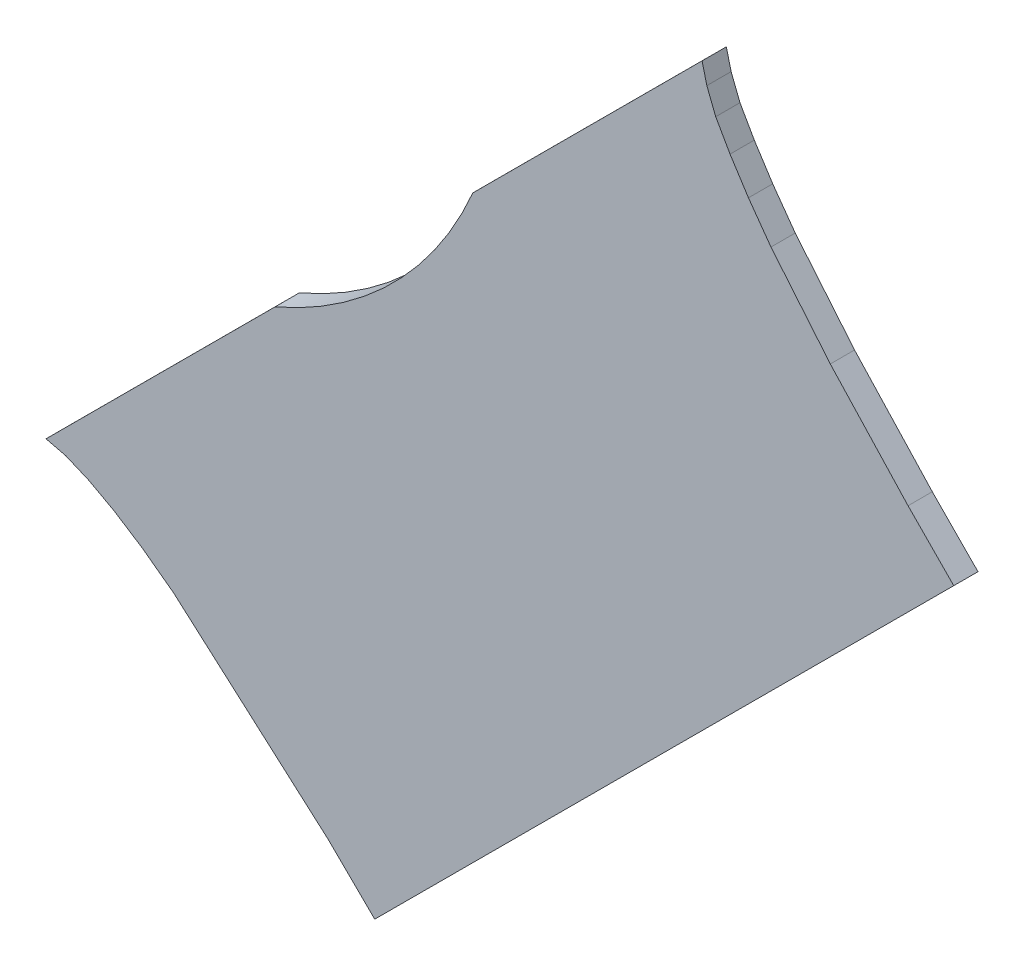
ISO-10303-21;
HEADER;
FILE_DESCRIPTION(('STEP AP214'),'2;1');
FILE_NAME('part.step','',(''),(''),'','','');
FILE_SCHEMA(('AUTOMOTIVE_DESIGN { 1 0 10303 214 1 1 1 1 }'));
ENDSEC;
DATA;
#1=APPLICATION_CONTEXT('core data for automotive mechanical design processes');
#2=APPLICATION_PROTOCOL_DEFINITION('international standard','automotive_design',2000,#1);
#3=PRODUCT_CONTEXT('',#1,'mechanical');
#4=PRODUCT('Part','Part','',(#3));
#5=PRODUCT_RELATED_PRODUCT_CATEGORY('part','',(#4));
#6=PRODUCT_DEFINITION_FORMATION('','',#4);
#7=PRODUCT_DEFINITION_CONTEXT('part definition',#1,'design');
#8=PRODUCT_DEFINITION('design','',#6,#7);
#9=PRODUCT_DEFINITION_SHAPE('','',#8);
#10=(LENGTH_UNIT() NAMED_UNIT(*) SI_UNIT(.MILLI.,.METRE.));
#11=(NAMED_UNIT(*) PLANE_ANGLE_UNIT() SI_UNIT($,.RADIAN.));
#12=(NAMED_UNIT(*) SI_UNIT($,.STERADIAN.) SOLID_ANGLE_UNIT());
#13=UNCERTAINTY_MEASURE_WITH_UNIT(LENGTH_MEASURE(1.E-05),#10,'distance_accuracy_value','');
#14=(GEOMETRIC_REPRESENTATION_CONTEXT(3) GLOBAL_UNCERTAINTY_ASSIGNED_CONTEXT((#13)) GLOBAL_UNIT_ASSIGNED_CONTEXT((#10,
#11,#12)) REPRESENTATION_CONTEXT('',''));
#15=CARTESIAN_POINT('',(0.,0.,0.));
#16=DIRECTION('',(0.,0.,1.));
#17=DIRECTION('',(1.,0.,0.));
#18=AXIS2_PLACEMENT_3D('',#15,#16,#17);
#19=CARTESIAN_POINT('',(103.907997131348,56.0769996643066,0.));
#20=DIRECTION('',(-0.706687027672217,0.707526285674113,0.));
#21=DIRECTION('',(0.707526285674113,0.706687027672217,0.));
#22=AXIS2_PLACEMENT_3D('',#19,#20,#21);
#23=PLANE('',#22);
#24=DIRECTION('',(0.707526285674113,0.706687027672217,0.));
#25=VECTOR('',#24,1.);
#26=CARTESIAN_POINT('',(103.907997131348,56.0769996643066,0.03556));
#27=LINE('',#26,#25);
#28=CARTESIAN_POINT('',(103.907997131348,56.0769996643066,0.03556));
#29=VERTEX_POINT('',#28);
#30=CARTESIAN_POINT('',(104.75700378418,56.9249992370605,0.03556));
#31=VERTEX_POINT('',#30);
#32=EDGE_CURVE('E11',#29,#31,#27,.T.);
#33=ORIENTED_EDGE('',*,*,#32,.F.);
#34=DIRECTION('',(0.,0.,1.));
#35=VECTOR('',#34,1.);
#36=CARTESIAN_POINT('',(103.907997131348,56.0769996643066,0.));
#37=LINE('',#36,#35);
#38=CARTESIAN_POINT('',(103.907997131348,56.0769996643066,0.));
#39=VERTEX_POINT('',#38);
#40=EDGE_CURVE('E24',#39,#29,#37,.T.);
#41=ORIENTED_EDGE('',*,*,#40,.F.);
#42=DIRECTION('',(0.707526285674113,0.706687027672217,0.));
#43=VECTOR('',#42,1.);
#44=CARTESIAN_POINT('',(103.907997131348,56.0769996643066,0.));
#45=LINE('',#44,#43);
#46=CARTESIAN_POINT('',(104.75700378418,56.9249992370605,0.));
#47=VERTEX_POINT('',#46);
#48=EDGE_CURVE('E297',#39,#47,#45,.T.);
#49=ORIENTED_EDGE('',*,*,#48,.T.);
#50=DIRECTION('',(0.,0.,1.));
#51=VECTOR('',#50,1.);
#52=CARTESIAN_POINT('',(104.75700378418,56.9249992370605,0.));
#53=LINE('',#52,#51);
#54=EDGE_CURVE('E37',#47,#31,#53,.T.);
#55=ORIENTED_EDGE('',*,*,#54,.T.);
#56=EDGE_LOOP('',(#33,#41,#49,#55));
#57=FACE_BOUND('',#56,.T.);
#58=ADVANCED_FACE('F17',(#57),#23,.F.);
#59=CARTESIAN_POINT('',(103.839996337891,56.1440010070801,0.));
#60=DIRECTION('',(0.701852680042072,0.712322129038373,0.));
#61=DIRECTION('',(0.712322129038373,-0.701852680042072,0.));
#62=AXIS2_PLACEMENT_3D('',#59,#60,#61);
#63=PLANE('',#62);
#64=DIRECTION('',(0.712322129038373,-0.701852680042072,0.));
#65=VECTOR('',#64,1.);
#66=CARTESIAN_POINT('',(103.839996337891,56.1440010070801,0.03556));
#67=LINE('',#66,#65);
#68=CARTESIAN_POINT('',(103.839996337891,56.1440010070801,0.03556));
#69=VERTEX_POINT('',#68);
#70=EDGE_CURVE('E293',#69,#29,#67,.T.);
#71=ORIENTED_EDGE('',*,*,#70,.F.);
#72=DIRECTION('',(0.,0.,1.));
#73=VECTOR('',#72,1.);
#74=CARTESIAN_POINT('',(103.839996337891,56.1440010070801,0.));
#75=LINE('',#74,#73);
#76=CARTESIAN_POINT('',(103.839996337891,56.1440010070801,0.));
#77=VERTEX_POINT('',#76);
#78=EDGE_CURVE('E291',#77,#69,#75,.T.);
#79=ORIENTED_EDGE('',*,*,#78,.F.);
#80=DIRECTION('',(0.712322129038373,-0.701852680042072,0.));
#81=VECTOR('',#80,1.);
#82=CARTESIAN_POINT('',(103.839996337891,56.1440010070801,0.));
#83=LINE('',#82,#81);
#84=EDGE_CURVE('E289',#77,#39,#83,.T.);
#85=ORIENTED_EDGE('',*,*,#84,.T.);
#86=ORIENTED_EDGE('',*,*,#40,.T.);
#87=EDGE_LOOP('',(#71,#79,#85,#86));
#88=FACE_BOUND('',#87,.T.);
#89=ADVANCED_FACE('F300',(#88),#63,.F.);
#90=CARTESIAN_POINT('',(103.612998962402,56.3440017700195,0.));
#91=DIRECTION('',(0.661080575392602,0.75031491577776,0.));
#92=DIRECTION('',(0.75031491577776,-0.661080575392602,0.));
#93=AXIS2_PLACEMENT_3D('',#90,#91,#92);
#94=PLANE('',#93);
#95=DIRECTION('',(0.75031491577776,-0.661080575392602,0.));
#96=VECTOR('',#95,1.);
#97=CARTESIAN_POINT('',(103.612998962402,56.3440017700195,0.03556));
#98=LINE('',#97,#96);
#99=CARTESIAN_POINT('',(103.612998962402,56.3440017700195,0.03556));
#100=VERTEX_POINT('',#99);
#101=EDGE_CURVE('E286',#100,#69,#98,.T.);
#102=ORIENTED_EDGE('',*,*,#101,.F.);
#103=DIRECTION('',(0.,0.,1.));
#104=VECTOR('',#103,1.);
#105=CARTESIAN_POINT('',(103.612998962402,56.3440017700195,0.));
#106=LINE('',#105,#104);
#107=CARTESIAN_POINT('',(103.612998962402,56.3440017700195,0.));
#108=VERTEX_POINT('',#107);
#109=EDGE_CURVE('E284',#108,#100,#106,.T.);
#110=ORIENTED_EDGE('',*,*,#109,.F.);
#111=DIRECTION('',(0.75031491577776,-0.661080575392602,0.));
#112=VECTOR('',#111,1.);
#113=CARTESIAN_POINT('',(103.612998962402,56.3440017700195,0.));
#114=LINE('',#113,#112);
#115=EDGE_CURVE('E281',#108,#77,#114,.T.);
#116=ORIENTED_EDGE('',*,*,#115,.T.);
#117=ORIENTED_EDGE('',*,*,#78,.T.);
#118=EDGE_LOOP('',(#102,#110,#116,#117));
#119=FACE_BOUND('',#118,.T.);
#120=ADVANCED_FACE('F303',(#119),#94,.F.);
#121=CARTESIAN_POINT('',(103.567001342773,56.3779983520508,0.));
#122=DIRECTION('',(0.594372308476259,0.804190001751205,0.));
#123=DIRECTION('',(0.804190001751205,-0.594372308476259,0.));
#124=AXIS2_PLACEMENT_3D('',#121,#122,#123);
#125=PLANE('',#124);
#126=DIRECTION('',(0.804190001751205,-0.594372308476259,0.));
#127=VECTOR('',#126,1.);
#128=CARTESIAN_POINT('',(103.567001342773,56.3779983520508,0.03556));
#129=LINE('',#128,#127);
#130=CARTESIAN_POINT('',(103.567001342773,56.3779983520508,0.03556));
#131=VERTEX_POINT('',#130);
#132=EDGE_CURVE('E278',#131,#100,#129,.T.);
#133=ORIENTED_EDGE('',*,*,#132,.F.);
#134=DIRECTION('',(0.,0.,1.));
#135=VECTOR('',#134,1.);
#136=CARTESIAN_POINT('',(103.567001342773,56.3779983520508,0.));
#137=LINE('',#136,#135);
#138=CARTESIAN_POINT('',(103.567001342773,56.3779983520508,0.));
#139=VERTEX_POINT('',#138);
#140=EDGE_CURVE('E276',#139,#131,#137,.T.);
#141=ORIENTED_EDGE('',*,*,#140,.F.);
#142=DIRECTION('',(0.804190001751205,-0.594372308476259,0.));
#143=VECTOR('',#142,1.);
#144=CARTESIAN_POINT('',(103.567001342773,56.3779983520508,0.));
#145=LINE('',#144,#143);
#146=EDGE_CURVE('E273',#139,#108,#145,.T.);
#147=ORIENTED_EDGE('',*,*,#146,.T.);
#148=ORIENTED_EDGE('',*,*,#109,.T.);
#149=EDGE_LOOP('',(#133,#141,#147,#148));
#150=FACE_BOUND('',#149,.T.);
#151=ADVANCED_FACE('F308',(#150),#125,.F.);
#152=CARTESIAN_POINT('',(103.525001525879,56.4049987792969,0.));
#153=DIRECTION('',(0.540765314121708,0.841173510664031,0.));
#154=DIRECTION('',(0.841173510664031,-0.540765314121708,0.));
#155=AXIS2_PLACEMENT_3D('',#152,#153,#154);
#156=PLANE('',#155);
#157=DIRECTION('',(0.841173510664031,-0.540765314121708,0.));
#158=VECTOR('',#157,1.);
#159=CARTESIAN_POINT('',(103.525001525879,56.4049987792969,0.03556));
#160=LINE('',#159,#158);
#161=CARTESIAN_POINT('',(103.525001525879,56.4049987792969,0.03556));
#162=VERTEX_POINT('',#161);
#163=EDGE_CURVE('E270',#162,#131,#160,.T.);
#164=ORIENTED_EDGE('',*,*,#163,.F.);
#165=DIRECTION('',(0.,0.,1.));
#166=VECTOR('',#165,1.);
#167=CARTESIAN_POINT('',(103.525001525879,56.4049987792969,0.));
#168=LINE('',#167,#166);
#169=CARTESIAN_POINT('',(103.525001525879,56.4049987792969,0.));
#170=VERTEX_POINT('',#169);
#171=EDGE_CURVE('E268',#170,#162,#168,.T.);
#172=ORIENTED_EDGE('',*,*,#171,.F.);
#173=DIRECTION('',(0.841173510664031,-0.540765314121708,0.));
#174=VECTOR('',#173,1.);
#175=CARTESIAN_POINT('',(103.525001525879,56.4049987792969,0.));
#176=LINE('',#175,#174);
#177=EDGE_CURVE('E265',#170,#139,#176,.T.);
#178=ORIENTED_EDGE('',*,*,#177,.T.);
#179=ORIENTED_EDGE('',*,*,#140,.T.);
#180=EDGE_LOOP('',(#164,#172,#178,#179));
#181=FACE_BOUND('',#180,.T.);
#182=ADVANCED_FACE('F311',(#181),#156,.F.);
#183=CARTESIAN_POINT('',(103.487998962402,56.4249992370605,0.));
#184=DIRECTION('',(0.475499962172643,0.879715741574411,0.));
#185=DIRECTION('',(0.879715741574411,-0.475499962172643,0.));
#186=AXIS2_PLACEMENT_3D('',#183,#184,#185);
#187=PLANE('',#186);
#188=DIRECTION('',(0.879715741574411,-0.475499962172643,0.));
#189=VECTOR('',#188,1.);
#190=CARTESIAN_POINT('',(103.487998962402,56.4249992370605,0.03556));
#191=LINE('',#190,#189);
#192=CARTESIAN_POINT('',(103.487998962402,56.4249992370605,0.03556));
#193=VERTEX_POINT('',#192);
#194=EDGE_CURVE('E262',#193,#162,#191,.T.);
#195=ORIENTED_EDGE('',*,*,#194,.F.);
#196=DIRECTION('',(0.,0.,1.));
#197=VECTOR('',#196,1.);
#198=CARTESIAN_POINT('',(103.487998962402,56.4249992370605,0.));
#199=LINE('',#198,#197);
#200=CARTESIAN_POINT('',(103.487998962402,56.4249992370605,0.));
#201=VERTEX_POINT('',#200);
#202=EDGE_CURVE('E260',#201,#193,#199,.T.);
#203=ORIENTED_EDGE('',*,*,#202,.F.);
#204=DIRECTION('',(0.879715741574411,-0.475499962172643,0.));
#205=VECTOR('',#204,1.);
#206=CARTESIAN_POINT('',(103.487998962402,56.4249992370605,0.));
#207=LINE('',#206,#205);
#208=EDGE_CURVE('E257',#201,#170,#207,.T.);
#209=ORIENTED_EDGE('',*,*,#208,.T.);
#210=ORIENTED_EDGE('',*,*,#171,.T.);
#211=EDGE_LOOP('',(#195,#203,#209,#210));
#212=FACE_BOUND('',#211,.T.);
#213=ADVANCED_FACE('F316',(#212),#187,.F.);
#214=CARTESIAN_POINT('',(103.455001831055,56.4389991760254,0.));
#215=DIRECTION('',(0.390577177437888,0.920570186604287,0.));
#216=DIRECTION('',(0.920570186604287,-0.390577177437888,0.));
#217=AXIS2_PLACEMENT_3D('',#214,#215,#216);
#218=PLANE('',#217);
#219=DIRECTION('',(0.920570186604287,-0.390577177437888,0.));
#220=VECTOR('',#219,1.);
#221=CARTESIAN_POINT('',(103.455001831055,56.4389991760254,0.03556));
#222=LINE('',#221,#220);
#223=CARTESIAN_POINT('',(103.455001831055,56.4389991760254,0.03556));
#224=VERTEX_POINT('',#223);
#225=EDGE_CURVE('E254',#224,#193,#222,.T.);
#226=ORIENTED_EDGE('',*,*,#225,.F.);
#227=DIRECTION('',(0.,0.,1.));
#228=VECTOR('',#227,1.);
#229=CARTESIAN_POINT('',(103.455001831055,56.4389991760254,0.));
#230=LINE('',#229,#228);
#231=CARTESIAN_POINT('',(103.455001831055,56.4389991760254,0.));
#232=VERTEX_POINT('',#231);
#233=EDGE_CURVE('E252',#232,#224,#230,.T.);
#234=ORIENTED_EDGE('',*,*,#233,.F.);
#235=DIRECTION('',(0.920570186604287,-0.390577177437888,0.));
#236=VECTOR('',#235,1.);
#237=CARTESIAN_POINT('',(103.455001831055,56.4389991760254,0.));
#238=LINE('',#237,#236);
#239=EDGE_CURVE('E249',#232,#201,#238,.T.);
#240=ORIENTED_EDGE('',*,*,#239,.T.);
#241=ORIENTED_EDGE('',*,*,#202,.T.);
#242=EDGE_LOOP('',(#226,#234,#240,#241));
#243=FACE_BOUND('',#242,.T.);
#244=ADVANCED_FACE('F319',(#243),#218,.F.);
#245=CARTESIAN_POINT('',(103.426002502441,56.4459991455078,0.));
#246=DIRECTION('',(0.234644699710009,0.972081202831327,0.));
#247=DIRECTION('',(0.972081202831327,-0.234644699710009,0.));
#248=AXIS2_PLACEMENT_3D('',#245,#246,#247);
#249=PLANE('',#248);
#250=DIRECTION('',(0.972081202831327,-0.234644699710009,0.));
#251=VECTOR('',#250,1.);
#252=CARTESIAN_POINT('',(103.426002502441,56.4459991455078,0.03556));
#253=LINE('',#252,#251);
#254=CARTESIAN_POINT('',(103.426002502441,56.4459991455078,0.03556));
#255=VERTEX_POINT('',#254);
#256=EDGE_CURVE('E246',#255,#224,#253,.T.);
#257=ORIENTED_EDGE('',*,*,#256,.F.);
#258=DIRECTION('',(0.,0.,1.));
#259=VECTOR('',#258,1.);
#260=CARTESIAN_POINT('',(103.426002502441,56.4459991455078,0.));
#261=LINE('',#260,#259);
#262=CARTESIAN_POINT('',(103.426002502441,56.4459991455078,0.));
#263=VERTEX_POINT('',#262);
#264=EDGE_CURVE('E244',#263,#255,#261,.T.);
#265=ORIENTED_EDGE('',*,*,#264,.F.);
#266=DIRECTION('',(0.972081202831327,-0.234644699710009,0.));
#267=VECTOR('',#266,1.);
#268=CARTESIAN_POINT('',(103.426002502441,56.4459991455078,0.));
#269=LINE('',#268,#267);
#270=EDGE_CURVE('E241',#263,#232,#269,.T.);
#271=ORIENTED_EDGE('',*,*,#270,.T.);
#272=ORIENTED_EDGE('',*,*,#233,.T.);
#273=EDGE_LOOP('',(#257,#265,#271,#272));
#274=FACE_BOUND('',#273,.T.);
#275=ADVANCED_FACE('F324',(#274),#249,.F.);
#276=CARTESIAN_POINT('',(103.761901608701,56.7815506073412,0.));
#277=DIRECTION('',(0.706740580981612,-0.707472791839922,0.));
#278=DIRECTION('',(-0.707472791839922,-0.706740580981612,0.));
#279=AXIS2_PLACEMENT_3D('',#276,#277,#278);
#280=PLANE('',#279);
#281=DIRECTION('',(-0.707472791839922,-0.706740580981612,0.));
#282=VECTOR('',#281,1.);
#283=CARTESIAN_POINT('',(104.388000488281,57.4070014953613,0.03556));
#284=LINE('',#283,#282);
#285=CARTESIAN_POINT('',(103.761901608701,56.7815506073412,0.03556));
#286=VERTEX_POINT('',#285);
#287=EDGE_CURVE('E238',#286,#255,#284,.T.);
#288=ORIENTED_EDGE('',*,*,#287,.F.);
#289=DIRECTION('',(0.,0.,1.));
#290=VECTOR('',#289,1.);
#291=CARTESIAN_POINT('',(103.761901608701,56.7815506073412,0.));
#292=LINE('',#291,#290);
#293=CARTESIAN_POINT('',(103.761901608701,56.7815506073412,0.));
#294=VERTEX_POINT('',#293);
#295=EDGE_CURVE('E236',#294,#286,#292,.T.);
#296=ORIENTED_EDGE('',*,*,#295,.F.);
#297=DIRECTION('',(-0.707472791839922,-0.706740580981612,0.));
#298=VECTOR('',#297,1.);
#299=CARTESIAN_POINT('',(104.388000488281,57.4070014953613,0.));
#300=LINE('',#299,#298);
#301=EDGE_CURVE('E233',#294,#263,#300,.T.);
#302=ORIENTED_EDGE('',*,*,#301,.T.);
#303=ORIENTED_EDGE('',*,*,#264,.T.);
#304=EDGE_LOOP('',(#288,#296,#302,#303));
#305=FACE_BOUND('',#304,.T.);
#306=ADVANCED_FACE('F327',(#305),#280,.F.);
#307=CARTESIAN_POINT('',(103.546148,57.2874648,0.));
#308=DIRECTION('',(0.,0.,-1.));
#309=DIRECTION('',(1.,0.,0.));
#310=AXIS2_PLACEMENT_3D('',#307,#308,#309);
#311=CYLINDRICAL_SURFACE('',#310,0.5499989);
#312=ORIENTED_EDGE('',*,*,#295,.T.);
#313=CARTESIAN_POINT('',(103.546148,57.2874648,0.03556));
#314=DIRECTION('',(0.,0.,1.));
#315=DIRECTION('',(1.,0.,0.));
#316=AXIS2_PLACEMENT_3D('',#313,#314,#315);
#317=CIRCLE('',#316,0.5499989);
#318=CARTESIAN_POINT('',(104.051838508045,57.0711874316171,0.03556));
#319=VERTEX_POINT('',#318);
#320=EDGE_CURVE('E230',#286,#319,#317,.T.);
#321=ORIENTED_EDGE('',*,*,#320,.T.);
#322=DIRECTION('',(0.,0.,1.));
#323=VECTOR('',#322,1.);
#324=CARTESIAN_POINT('',(104.051838508045,57.0711874316171,0.));
#325=LINE('',#324,#323);
#326=CARTESIAN_POINT('',(104.051838508045,57.0711874316171,0.));
#327=VERTEX_POINT('',#326);
#328=EDGE_CURVE('E228',#327,#319,#325,.T.);
#329=ORIENTED_EDGE('',*,*,#328,.F.);
#330=CARTESIAN_POINT('',(103.546148,57.2874648,0.));
#331=DIRECTION('',(0.,0.,1.));
#332=DIRECTION('',(1.,0.,0.));
#333=AXIS2_PLACEMENT_3D('',#330,#331,#332);
#334=CIRCLE('',#333,0.5499989);
#335=EDGE_CURVE('E225',#294,#327,#334,.T.);
#336=ORIENTED_EDGE('',*,*,#335,.F.);
#337=EDGE_LOOP('',(#312,#321,#329,#336));
#338=FACE_BOUND('',#337,.T.);
#339=ADVANCED_FACE('F333',(#338),#311,.F.);
#340=CARTESIAN_POINT('',(104.388000488281,57.4070014953613,0.));
#341=DIRECTION('',(0.706740580981612,-0.707472791839922,0.));
#342=DIRECTION('',(-0.707472791839922,-0.706740580981612,0.));
#343=AXIS2_PLACEMENT_3D('',#340,#341,#342);
#344=PLANE('',#343);
#345=DIRECTION('',(-0.707472791839922,-0.706740580981612,0.));
#346=VECTOR('',#345,1.);
#347=CARTESIAN_POINT('',(104.388000488281,57.4070014953613,0.03556));
#348=LINE('',#347,#346);
#349=CARTESIAN_POINT('',(104.388000488281,57.4070014953613,0.03556));
#350=VERTEX_POINT('',#349);
#351=EDGE_CURVE('E222',#350,#319,#348,.T.);
#352=ORIENTED_EDGE('',*,*,#351,.F.);
#353=DIRECTION('',(0.,0.,1.));
#354=VECTOR('',#353,1.);
#355=CARTESIAN_POINT('',(104.388000488281,57.4070014953613,0.));
#356=LINE('',#355,#354);
#357=CARTESIAN_POINT('',(104.388000488281,57.4070014953613,0.));
#358=VERTEX_POINT('',#357);
#359=EDGE_CURVE('E220',#358,#350,#356,.T.);
#360=ORIENTED_EDGE('',*,*,#359,.F.);
#361=EDGE_CURVE('E219',#358,#327,#300,.T.);
#362=ORIENTED_EDGE('',*,*,#361,.T.);
#363=ORIENTED_EDGE('',*,*,#328,.T.);
#364=EDGE_LOOP('',(#352,#360,#362,#363));
#365=FACE_BOUND('',#364,.T.);
#366=ADVANCED_FACE('F336',(#365),#344,.F.);
#367=CARTESIAN_POINT('',(104.394996643066,57.3790016174316,0.));
#368=DIRECTION('',(-0.970173592460836,-0.242411221876454,0.));
#369=DIRECTION('',(-0.242411221876454,0.970173592460836,0.));
#370=AXIS2_PLACEMENT_3D('',#367,#368,#369);
#371=PLANE('',#370);
#372=DIRECTION('',(-0.242411221876454,0.970173592460836,0.));
#373=VECTOR('',#372,1.);
#374=CARTESIAN_POINT('',(104.394996643066,57.3790016174316,0.03556));
#375=LINE('',#374,#373);
#376=CARTESIAN_POINT('',(104.394996643066,57.3790016174316,0.03556));
#377=VERTEX_POINT('',#376);
#378=EDGE_CURVE('E216',#377,#350,#375,.T.);
#379=ORIENTED_EDGE('',*,*,#378,.F.);
#380=DIRECTION('',(0.,0.,1.));
#381=VECTOR('',#380,1.);
#382=CARTESIAN_POINT('',(104.394996643066,57.3790016174316,0.));
#383=LINE('',#382,#381);
#384=CARTESIAN_POINT('',(104.394996643066,57.3790016174316,0.));
#385=VERTEX_POINT('',#384);
#386=EDGE_CURVE('E214',#385,#377,#383,.T.);
#387=ORIENTED_EDGE('',*,*,#386,.F.);
#388=DIRECTION('',(-0.242411221876454,0.970173592460836,0.));
#389=VECTOR('',#388,1.);
#390=CARTESIAN_POINT('',(104.394996643066,57.3790016174316,0.));
#391=LINE('',#390,#389);
#392=EDGE_CURVE('E211',#385,#358,#391,.T.);
#393=ORIENTED_EDGE('',*,*,#392,.T.);
#394=ORIENTED_EDGE('',*,*,#359,.T.);
#395=EDGE_LOOP('',(#379,#387,#393,#394));
#396=FACE_BOUND('',#395,.T.);
#397=ADVANCED_FACE('F341',(#396),#371,.F.);
#398=CARTESIAN_POINT('',(104.407997131348,57.3460006713867,0.));
#399=DIRECTION('',(-0.930407281415099,-0.36652733962116,0.));
#400=DIRECTION('',(-0.36652733962116,0.930407281415099,0.));
#401=AXIS2_PLACEMENT_3D('',#398,#399,#400);
#402=PLANE('',#401);
#403=DIRECTION('',(-0.36652733962116,0.930407281415099,0.));
#404=VECTOR('',#403,1.);
#405=CARTESIAN_POINT('',(104.407997131348,57.3460006713867,0.03556));
#406=LINE('',#405,#404);
#407=CARTESIAN_POINT('',(104.407997131348,57.3460006713867,0.03556));
#408=VERTEX_POINT('',#407);
#409=EDGE_CURVE('E208',#408,#377,#406,.T.);
#410=ORIENTED_EDGE('',*,*,#409,.F.);
#411=DIRECTION('',(0.,0.,1.));
#412=VECTOR('',#411,1.);
#413=CARTESIAN_POINT('',(104.407997131348,57.3460006713867,0.));
#414=LINE('',#413,#412);
#415=CARTESIAN_POINT('',(104.407997131348,57.3460006713867,0.));
#416=VERTEX_POINT('',#415);
#417=EDGE_CURVE('E206',#416,#408,#414,.T.);
#418=ORIENTED_EDGE('',*,*,#417,.F.);
#419=DIRECTION('',(-0.36652733962116,0.930407281415099,0.));
#420=VECTOR('',#419,1.);
#421=CARTESIAN_POINT('',(104.407997131348,57.3460006713867,0.));
#422=LINE('',#421,#420);
#423=EDGE_CURVE('E203',#416,#385,#422,.T.);
#424=ORIENTED_EDGE('',*,*,#423,.T.);
#425=ORIENTED_EDGE('',*,*,#386,.T.);
#426=EDGE_LOOP('',(#410,#418,#424,#425));
#427=FACE_BOUND('',#426,.T.);
#428=ADVANCED_FACE('F344',(#427),#402,.F.);
#429=CARTESIAN_POINT('',(104.429000854492,57.3089981079102,0.));
#430=DIRECTION('',(-0.869663029735842,-0.493645839353149,0.));
#431=DIRECTION('',(-0.493645839353149,0.869663029735842,0.));
#432=AXIS2_PLACEMENT_3D('',#429,#430,#431);
#433=PLANE('',#432);
#434=DIRECTION('',(-0.493645839353149,0.869663029735842,0.));
#435=VECTOR('',#434,1.);
#436=CARTESIAN_POINT('',(104.429000854492,57.3089981079102,0.03556));
#437=LINE('',#436,#435);
#438=CARTESIAN_POINT('',(104.429000854492,57.3089981079102,0.03556));
#439=VERTEX_POINT('',#438);
#440=EDGE_CURVE('E200',#439,#408,#437,.T.);
#441=ORIENTED_EDGE('',*,*,#440,.F.);
#442=DIRECTION('',(0.,0.,1.));
#443=VECTOR('',#442,1.);
#444=CARTESIAN_POINT('',(104.429000854492,57.3089981079102,0.));
#445=LINE('',#444,#443);
#446=CARTESIAN_POINT('',(104.429000854492,57.3089981079102,0.));
#447=VERTEX_POINT('',#446);
#448=EDGE_CURVE('E198',#447,#439,#445,.T.);
#449=ORIENTED_EDGE('',*,*,#448,.F.);
#450=DIRECTION('',(-0.493645839353149,0.869663029735842,0.));
#451=VECTOR('',#450,1.);
#452=CARTESIAN_POINT('',(104.429000854492,57.3089981079102,0.));
#453=LINE('',#452,#451);
#454=EDGE_CURVE('E195',#447,#416,#453,.T.);
#455=ORIENTED_EDGE('',*,*,#454,.T.);
#456=ORIENTED_EDGE('',*,*,#417,.T.);
#457=EDGE_LOOP('',(#441,#449,#455,#456));
#458=FACE_BOUND('',#457,.T.);
#459=ADVANCED_FACE('F349',(#458),#433,.F.);
#460=CARTESIAN_POINT('',(104.456001281738,57.2669982910156,0.));
#461=DIRECTION('',(-0.841173510664031,-0.540765314121708,0.));
#462=DIRECTION('',(-0.540765314121708,0.841173510664031,0.));
#463=AXIS2_PLACEMENT_3D('',#460,#461,#462);
#464=PLANE('',#463);
#465=DIRECTION('',(-0.540765314121708,0.841173510664031,0.));
#466=VECTOR('',#465,1.);
#467=CARTESIAN_POINT('',(104.456001281738,57.2669982910156,0.03556));
#468=LINE('',#467,#466);
#469=CARTESIAN_POINT('',(104.456001281738,57.2669982910156,0.03556));
#470=VERTEX_POINT('',#469);
#471=EDGE_CURVE('E192',#470,#439,#468,.T.);
#472=ORIENTED_EDGE('',*,*,#471,.F.);
#473=DIRECTION('',(0.,0.,1.));
#474=VECTOR('',#473,1.);
#475=CARTESIAN_POINT('',(104.456001281738,57.2669982910156,0.));
#476=LINE('',#475,#474);
#477=CARTESIAN_POINT('',(104.456001281738,57.2669982910156,0.));
#478=VERTEX_POINT('',#477);
#479=EDGE_CURVE('E190',#478,#470,#476,.T.);
#480=ORIENTED_EDGE('',*,*,#479,.F.);
#481=DIRECTION('',(-0.540765314121708,0.841173510664031,0.));
#482=VECTOR('',#481,1.);
#483=CARTESIAN_POINT('',(104.456001281738,57.2669982910156,0.));
#484=LINE('',#483,#482);
#485=EDGE_CURVE('E187',#478,#447,#484,.T.);
#486=ORIENTED_EDGE('',*,*,#485,.T.);
#487=ORIENTED_EDGE('',*,*,#448,.T.);
#488=EDGE_LOOP('',(#472,#480,#486,#487));
#489=FACE_BOUND('',#488,.T.);
#490=ADVANCED_FACE('F352',(#489),#464,.F.);
#491=CARTESIAN_POINT('',(104.488998413086,57.2210006713867,0.));
#492=DIRECTION('',(-0.812547964283568,-0.582894334968723,0.));
#493=DIRECTION('',(-0.582894334968723,0.812547964283568,0.));
#494=AXIS2_PLACEMENT_3D('',#491,#492,#493);
#495=PLANE('',#494);
#496=DIRECTION('',(-0.582894334968723,0.812547964283568,0.));
#497=VECTOR('',#496,1.);
#498=CARTESIAN_POINT('',(104.488998413086,57.2210006713867,0.03556));
#499=LINE('',#498,#497);
#500=CARTESIAN_POINT('',(104.488998413086,57.2210006713867,0.03556));
#501=VERTEX_POINT('',#500);
#502=EDGE_CURVE('E184',#501,#470,#499,.T.);
#503=ORIENTED_EDGE('',*,*,#502,.F.);
#504=DIRECTION('',(0.,0.,1.));
#505=VECTOR('',#504,1.);
#506=CARTESIAN_POINT('',(104.488998413086,57.2210006713867,0.));
#507=LINE('',#506,#505);
#508=CARTESIAN_POINT('',(104.488998413086,57.2210006713867,0.));
#509=VERTEX_POINT('',#508);
#510=EDGE_CURVE('E182',#509,#501,#507,.T.);
#511=ORIENTED_EDGE('',*,*,#510,.F.);
#512=DIRECTION('',(-0.582894334968723,0.812547964283568,0.));
#513=VECTOR('',#512,1.);
#514=CARTESIAN_POINT('',(104.488998413086,57.2210006713867,0.));
#515=LINE('',#514,#513);
#516=EDGE_CURVE('E179',#509,#478,#515,.T.);
#517=ORIENTED_EDGE('',*,*,#516,.T.);
#518=ORIENTED_EDGE('',*,*,#479,.T.);
#519=EDGE_LOOP('',(#503,#511,#517,#518));
#520=FACE_BOUND('',#519,.T.);
#521=ADVANCED_FACE('F355',(#520),#495,.F.);
#522=CARTESIAN_POINT('',(104.575996398926,57.1160011291504,0.));
#523=DIRECTION('',(-0.770027451178247,-0.638010755733736,0.));
#524=DIRECTION('',(-0.638010755733736,0.770027451178247,0.));
#525=AXIS2_PLACEMENT_3D('',#522,#523,#524);
#526=PLANE('',#525);
#527=DIRECTION('',(-0.638010755733736,0.770027451178247,0.));
#528=VECTOR('',#527,1.);
#529=CARTESIAN_POINT('',(104.575996398926,57.1160011291504,0.03556));
#530=LINE('',#529,#528);
#531=CARTESIAN_POINT('',(104.575996398926,57.1160011291504,0.03556));
#532=VERTEX_POINT('',#531);
#533=EDGE_CURVE('E176',#532,#501,#530,.T.);
#534=ORIENTED_EDGE('',*,*,#533,.F.);
#535=DIRECTION('',(0.,0.,1.));
#536=VECTOR('',#535,1.);
#537=CARTESIAN_POINT('',(104.575996398926,57.1160011291504,0.));
#538=LINE('',#537,#536);
#539=CARTESIAN_POINT('',(104.575996398926,57.1160011291504,0.));
#540=VERTEX_POINT('',#539);
#541=EDGE_CURVE('E174',#540,#532,#538,.T.);
#542=ORIENTED_EDGE('',*,*,#541,.F.);
#543=DIRECTION('',(-0.638010755733736,0.770027451178247,0.));
#544=VECTOR('',#543,1.);
#545=CARTESIAN_POINT('',(104.575996398926,57.1160011291504,0.));
#546=LINE('',#545,#544);
#547=EDGE_CURVE('E165',#540,#509,#546,.T.);
#548=ORIENTED_EDGE('',*,*,#547,.T.);
#549=ORIENTED_EDGE('',*,*,#510,.T.);
#550=EDGE_LOOP('',(#534,#542,#548,#549));
#551=FACE_BOUND('',#550,.T.);
#552=ADVANCED_FACE('F358',(#551),#526,.F.);
#553=CARTESIAN_POINT('',(104.690002441406,56.9930000305176,0.));
#554=DIRECTION('',(-0.73341536064515,-0.679780779935521,0.));
#555=DIRECTION('',(-0.679780779935521,0.73341536064515,0.));
#556=AXIS2_PLACEMENT_3D('',#553,#554,#555);
#557=PLANE('',#556);
#558=DIRECTION('',(-0.679780779935521,0.73341536064515,0.));
#559=VECTOR('',#558,1.);
#560=CARTESIAN_POINT('',(104.690002441406,56.9930000305176,0.03556));
#561=LINE('',#560,#559);
#562=CARTESIAN_POINT('',(104.690002441406,56.9930000305176,0.03556));
#563=VERTEX_POINT('',#562);
#564=EDGE_CURVE('E151',#563,#532,#561,.T.);
#565=ORIENTED_EDGE('',*,*,#564,.F.);
#566=DIRECTION('',(0.,0.,1.));
#567=VECTOR('',#566,1.);
#568=CARTESIAN_POINT('',(104.690002441406,56.9930000305176,0.));
#569=LINE('',#568,#567);
#570=CARTESIAN_POINT('',(104.690002441406,56.9930000305176,0.));
#571=VERTEX_POINT('',#570);
#572=EDGE_CURVE('E146',#571,#563,#569,.T.);
#573=ORIENTED_EDGE('',*,*,#572,.F.);
#574=DIRECTION('',(-0.679780779935521,0.73341536064515,0.));
#575=VECTOR('',#574,1.);
#576=CARTESIAN_POINT('',(104.690002441406,56.9930000305176,0.));
#577=LINE('',#576,#575);
#578=EDGE_CURVE('E149',#571,#540,#577,.T.);
#579=ORIENTED_EDGE('',*,*,#578,.T.);
#580=ORIENTED_EDGE('',*,*,#541,.T.);
#581=EDGE_LOOP('',(#565,#573,#579,#580));
#582=FACE_BOUND('',#581,.T.);
#583=ADVANCED_FACE('F148',(#582),#557,.F.);
#584=CARTESIAN_POINT('',(104.75700378418,56.9249992370605,0.));
#585=DIRECTION('',(-0.712322129038373,-0.701852680042072,0.));
#586=DIRECTION('',(-0.701852680042072,0.712322129038373,0.));
#587=AXIS2_PLACEMENT_3D('',#584,#585,#586);
#588=PLANE('',#587);
#589=DIRECTION('',(-0.701852680042072,0.712322129038373,0.));
#590=VECTOR('',#589,1.);
#591=CARTESIAN_POINT('',(104.75700378418,56.9249992370605,0.03556));
#592=LINE('',#591,#590);
#593=EDGE_CURVE('E166',#31,#563,#592,.T.);
#594=ORIENTED_EDGE('',*,*,#593,.F.);
#595=ORIENTED_EDGE('',*,*,#54,.F.);
#596=DIRECTION('',(-0.701852680042072,0.712322129038373,0.));
#597=VECTOR('',#596,1.);
#598=CARTESIAN_POINT('',(104.75700378418,56.9249992370605,0.));
#599=LINE('',#598,#597);
#600=EDGE_CURVE('E162',#47,#571,#599,.T.);
#601=ORIENTED_EDGE('',*,*,#600,.T.);
#602=ORIENTED_EDGE('',*,*,#572,.T.);
#603=EDGE_LOOP('',(#594,#595,#601,#602));
#604=FACE_BOUND('',#603,.T.);
#605=ADVANCED_FACE('F168',(#604),#588,.F.);
#606=CARTESIAN_POINT('',(104.75700378418,56.9249992370605,0.));
#607=DIRECTION('',(0.,0.,1.));
#608=DIRECTION('',(1.,0.,0.));
#609=AXIS2_PLACEMENT_3D('',#606,#607,#608);
#610=PLANE('',#609);
#611=ORIENTED_EDGE('',*,*,#600,.F.);
#612=ORIENTED_EDGE('',*,*,#48,.F.);
#613=ORIENTED_EDGE('',*,*,#84,.F.);
#614=ORIENTED_EDGE('',*,*,#115,.F.);
#615=ORIENTED_EDGE('',*,*,#146,.F.);
#616=ORIENTED_EDGE('',*,*,#177,.F.);
#617=ORIENTED_EDGE('',*,*,#208,.F.);
#618=ORIENTED_EDGE('',*,*,#239,.F.);
#619=ORIENTED_EDGE('',*,*,#270,.F.);
#620=ORIENTED_EDGE('',*,*,#301,.F.);
#621=ORIENTED_EDGE('',*,*,#335,.T.);
#622=ORIENTED_EDGE('',*,*,#361,.F.);
#623=ORIENTED_EDGE('',*,*,#392,.F.);
#624=ORIENTED_EDGE('',*,*,#423,.F.);
#625=ORIENTED_EDGE('',*,*,#454,.F.);
#626=ORIENTED_EDGE('',*,*,#485,.F.);
#627=ORIENTED_EDGE('',*,*,#516,.F.);
#628=ORIENTED_EDGE('',*,*,#547,.F.);
#629=ORIENTED_EDGE('',*,*,#578,.F.);
#630=EDGE_LOOP('',(#611,#612,#613,#614,#615,#616,#617,#618,#619,#620,#621,#622,#623,#624,#625,
#626,#627,#628,#629));
#631=FACE_BOUND('',#630,.T.);
#632=ADVANCED_FACE('F160',(#631),#610,.F.);
#633=CARTESIAN_POINT('',(104.75700378418,56.9249992370605,0.03556));
#634=DIRECTION('',(0.,0.,1.));
#635=DIRECTION('',(1.,0.,0.));
#636=AXIS2_PLACEMENT_3D('',#633,#634,#635);
#637=PLANE('',#636);
#638=ORIENTED_EDGE('',*,*,#32,.T.);
#639=ORIENTED_EDGE('',*,*,#593,.T.);
#640=ORIENTED_EDGE('',*,*,#564,.T.);
#641=ORIENTED_EDGE('',*,*,#533,.T.);
#642=ORIENTED_EDGE('',*,*,#502,.T.);
#643=ORIENTED_EDGE('',*,*,#471,.T.);
#644=ORIENTED_EDGE('',*,*,#440,.T.);
#645=ORIENTED_EDGE('',*,*,#409,.T.);
#646=ORIENTED_EDGE('',*,*,#378,.T.);
#647=ORIENTED_EDGE('',*,*,#351,.T.);
#648=ORIENTED_EDGE('',*,*,#320,.F.);
#649=ORIENTED_EDGE('',*,*,#287,.T.);
#650=ORIENTED_EDGE('',*,*,#256,.T.);
#651=ORIENTED_EDGE('',*,*,#225,.T.);
#652=ORIENTED_EDGE('',*,*,#194,.T.);
#653=ORIENTED_EDGE('',*,*,#163,.T.);
#654=ORIENTED_EDGE('',*,*,#132,.T.);
#655=ORIENTED_EDGE('',*,*,#101,.T.);
#656=ORIENTED_EDGE('',*,*,#70,.T.);
#657=EDGE_LOOP('',(#638,#639,#640,#641,#642,#643,#644,#645,#646,#647,#648,#649,#650,#651,#652,
#653,#654,#655,#656));
#658=FACE_BOUND('',#657,.T.);
#659=ADVANCED_FACE('F360',(#658),#637,.T.);
#660=CLOSED_SHELL('',(#58,#89,#120,#151,#182,#213,#244,#275,#306,#339,#366,#397,#428,#459,#490,
#521,#552,#583,#605,#632,#659));
#661=MANIFOLD_SOLID_BREP('B1',#660);
#662=ADVANCED_BREP_SHAPE_REPRESENTATION('',(#18,#661),#14);
#663=SHAPE_DEFINITION_REPRESENTATION(#9,#662);
ENDSEC;
END-ISO-10303-21;
